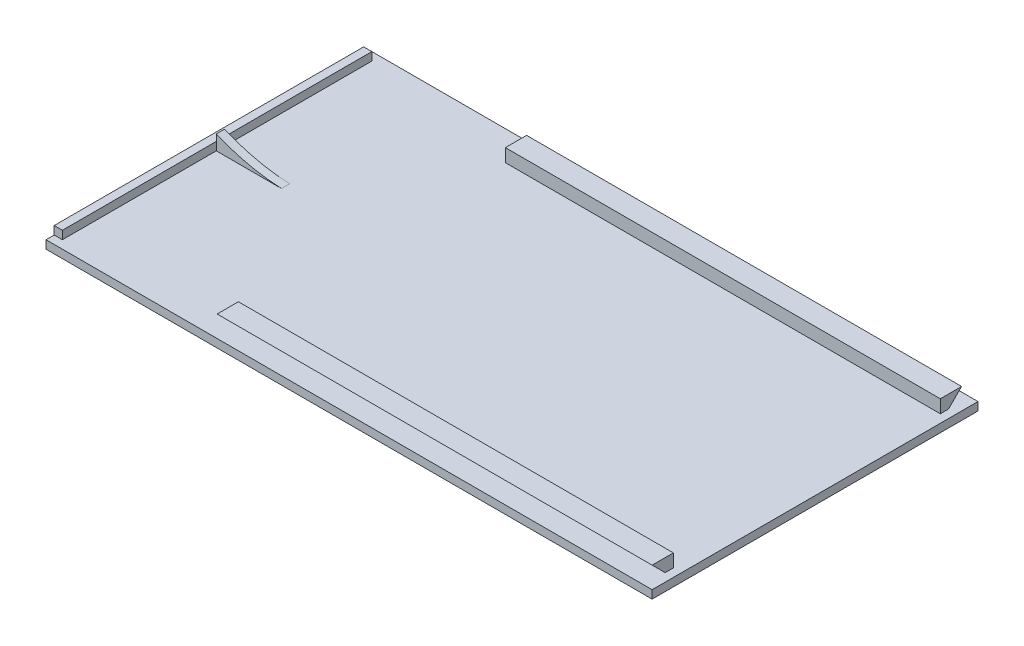
ISO-10303-21;
HEADER;
FILE_DESCRIPTION(('STEP AP214'),'2;1');
FILE_NAME('part.step','',(''),(''),'','','');
FILE_SCHEMA(('AUTOMOTIVE_DESIGN { 1 0 10303 214 1 1 1 1 }'));
ENDSEC;
DATA;
#1=APPLICATION_CONTEXT('core data for automotive mechanical design processes');
#2=APPLICATION_PROTOCOL_DEFINITION('international standard','automotive_design',2000,#1);
#3=PRODUCT_CONTEXT('',#1,'mechanical');
#4=PRODUCT('Part','Part','',(#3));
#5=PRODUCT_RELATED_PRODUCT_CATEGORY('part','',(#4));
#6=PRODUCT_DEFINITION_FORMATION('','',#4);
#7=PRODUCT_DEFINITION_CONTEXT('part definition',#1,'design');
#8=PRODUCT_DEFINITION('design','',#6,#7);
#9=PRODUCT_DEFINITION_SHAPE('','',#8);
#10=(LENGTH_UNIT() NAMED_UNIT(*) SI_UNIT(.MILLI.,.METRE.));
#11=(NAMED_UNIT(*) PLANE_ANGLE_UNIT() SI_UNIT($,.RADIAN.));
#12=(NAMED_UNIT(*) SI_UNIT($,.STERADIAN.) SOLID_ANGLE_UNIT());
#13=UNCERTAINTY_MEASURE_WITH_UNIT(LENGTH_MEASURE(1.E-05),#10,'distance_accuracy_value','');
#14=(GEOMETRIC_REPRESENTATION_CONTEXT(3) GLOBAL_UNCERTAINTY_ASSIGNED_CONTEXT((#13)) GLOBAL_UNIT_ASSIGNED_CONTEXT((#10,
#11,#12)) REPRESENTATION_CONTEXT('',''));
#15=CARTESIAN_POINT('',(0.,0.,0.));
#16=DIRECTION('',(0.,0.,1.));
#17=DIRECTION('',(1.,0.,0.));
#18=AXIS2_PLACEMENT_3D('',#15,#16,#17);
#19=CARTESIAN_POINT('',(0.,1.26,0.));
#20=DIRECTION('',(0.,-1.,0.));
#21=DIRECTION('',(0.,0.,-1.));
#22=AXIS2_PLACEMENT_3D('',#19,#20,#21);
#23=PLANE('',#22);
#24=DIRECTION('',(0.,0.,1.));
#25=VECTOR('',#24,1.);
#26=CARTESIAN_POINT('',(25.,1.26,-45.48));
#27=LINE('',#26,#25);
#28=CARTESIAN_POINT('',(25.,1.26,-46.7377762362813));
#29=VERTEX_POINT('',#28);
#30=CARTESIAN_POINT('',(25.,1.26,-45.48));
#31=VERTEX_POINT('',#30);
#32=EDGE_CURVE('E58',#29,#31,#27,.T.);
#33=ORIENTED_EDGE('',*,*,#32,.F.);
#34=DIRECTION('',(1.,0.,0.));
#35=VECTOR('',#34,1.);
#36=CARTESIAN_POINT('',(19.74,1.26,-46.7377762362813));
#37=LINE('',#36,#35);
#38=CARTESIAN_POINT('',(91.74,1.26,-46.7377762362813));
#39=VERTEX_POINT('',#38);
#40=EDGE_CURVE('E194',#29,#39,#37,.T.);
#41=ORIENTED_EDGE('',*,*,#40,.T.);
#42=DIRECTION('',(0.,0.,-1.));
#43=VECTOR('',#42,1.);
#44=CARTESIAN_POINT('',(91.74,1.26,-45.48));
#45=LINE('',#44,#43);
#46=CARTESIAN_POINT('',(91.74,1.26,-45.48));
#47=VERTEX_POINT('',#46);
#48=EDGE_CURVE('E193',#47,#39,#45,.T.);
#49=ORIENTED_EDGE('',*,*,#48,.F.);
#50=DIRECTION('',(1.,0.,0.));
#51=VECTOR('',#50,1.);
#52=CARTESIAN_POINT('',(25.,1.26,-45.48));
#53=LINE('',#52,#51);
#54=EDGE_CURVE('E205',#31,#47,#53,.T.);
#55=ORIENTED_EDGE('',*,*,#54,.F.);
#56=EDGE_LOOP('',(#33,#41,#49,#55));
#57=FACE_BOUND('',#56,.T.);
#58=DIRECTION('',(1.,0.,0.));
#59=VECTOR('',#58,1.);
#60=CARTESIAN_POINT('',(19.74,1.26,-3.26222376371873));
#61=LINE('',#60,#59);
#62=CARTESIAN_POINT('',(25.,1.26,-3.26222376371873));
#63=VERTEX_POINT('',#62);
#64=CARTESIAN_POINT('',(91.74,1.26,-3.26222376371873));
#65=VERTEX_POINT('',#64);
#66=EDGE_CURVE('E579',#63,#65,#61,.T.);
#67=ORIENTED_EDGE('',*,*,#66,.F.);
#68=DIRECTION('',(0.,0.,1.));
#69=VECTOR('',#68,1.);
#70=CARTESIAN_POINT('',(25.,1.26,-1.26));
#71=LINE('',#70,#69);
#72=CARTESIAN_POINT('',(25.,1.26,-4.52));
#73=VERTEX_POINT('',#72);
#74=EDGE_CURVE('E592',#73,#63,#71,.T.);
#75=ORIENTED_EDGE('',*,*,#74,.F.);
#76=DIRECTION('',(-1.,0.,0.));
#77=VECTOR('',#76,1.);
#78=CARTESIAN_POINT('',(25.,1.26,-4.52));
#79=LINE('',#78,#77);
#80=CARTESIAN_POINT('',(91.74,1.26,-4.52));
#81=VERTEX_POINT('',#80);
#82=EDGE_CURVE('E590',#81,#73,#79,.T.);
#83=ORIENTED_EDGE('',*,*,#82,.F.);
#84=DIRECTION('',(0.,0.,-1.));
#85=VECTOR('',#84,1.);
#86=CARTESIAN_POINT('',(91.74,1.26,-1.26));
#87=LINE('',#86,#85);
#88=EDGE_CURVE('E50',#65,#81,#87,.T.);
#89=ORIENTED_EDGE('',*,*,#88,.F.);
#90=EDGE_LOOP('',(#67,#75,#83,#89));
#91=FACE_BOUND('',#90,.T.);
#92=DIRECTION('',(1.,0.,0.));
#93=VECTOR('',#92,1.);
#94=CARTESIAN_POINT('',(1.25999999999998,1.26,-24.87));
#95=LINE('',#94,#93);
#96=CARTESIAN_POINT('',(1.25999999999998,1.26,-24.87));
#97=VERTEX_POINT('',#96);
#98=CARTESIAN_POINT('',(11.26,1.26,-24.87));
#99=VERTEX_POINT('',#98);
#100=EDGE_CURVE('E218',#97,#99,#95,.T.);
#101=ORIENTED_EDGE('',*,*,#100,.F.);
#102=DIRECTION('',(0.,0.,-1.));
#103=VECTOR('',#102,1.);
#104=CARTESIAN_POINT('',(1.25999999999997,1.26,-48.74));
#105=LINE('',#104,#103);
#106=CARTESIAN_POINT('',(1.25999999999998,1.26,-1.26));
#107=VERTEX_POINT('',#106);
#108=EDGE_CURVE('E250',#107,#97,#105,.T.);
#109=ORIENTED_EDGE('',*,*,#108,.F.);
#110=DIRECTION('',(1.,0.,0.));
#111=VECTOR('',#110,1.);
#112=CARTESIAN_POINT('',(0.,1.26,-1.26));
#113=LINE('',#112,#111);
#114=CARTESIAN_POINT('',(0.,1.26,-1.26));
#115=VERTEX_POINT('',#114);
#116=EDGE_CURVE('E235',#115,#107,#113,.T.);
#117=ORIENTED_EDGE('',*,*,#116,.F.);
#118=DIRECTION('',(0.,0.,1.));
#119=VECTOR('',#118,1.);
#120=CARTESIAN_POINT('',(0.,1.26,0.));
#121=LINE('',#120,#119);
#122=CARTESIAN_POINT('',(0.,1.26,0.));
#123=VERTEX_POINT('',#122);
#124=EDGE_CURVE('E287',#115,#123,#121,.T.);
#125=ORIENTED_EDGE('',*,*,#124,.T.);
#126=DIRECTION('',(1.,0.,0.));
#127=VECTOR('',#126,1.);
#128=CARTESIAN_POINT('',(0.,1.26,0.));
#129=LINE('',#128,#127);
#130=CARTESIAN_POINT('',(93.,1.26,0.));
#131=VERTEX_POINT('',#130);
#132=EDGE_CURVE('E283',#123,#131,#129,.T.);
#133=ORIENTED_EDGE('',*,*,#132,.T.);
#134=DIRECTION('',(0.,0.,-1.));
#135=VECTOR('',#134,1.);
#136=CARTESIAN_POINT('',(93.,1.26,0.));
#137=LINE('',#136,#135);
#138=CARTESIAN_POINT('',(93.,1.26,-50.));
#139=VERTEX_POINT('',#138);
#140=EDGE_CURVE('E309',#131,#139,#137,.T.);
#141=ORIENTED_EDGE('',*,*,#140,.T.);
#142=DIRECTION('',(-1.,0.,0.));
#143=VECTOR('',#142,1.);
#144=CARTESIAN_POINT('',(0.,1.26,-50.));
#145=LINE('',#144,#143);
#146=CARTESIAN_POINT('',(0.,1.26,-50.));
#147=VERTEX_POINT('',#146);
#148=EDGE_CURVE('E300',#139,#147,#145,.T.);
#149=ORIENTED_EDGE('',*,*,#148,.T.);
#150=CARTESIAN_POINT('',(0.,1.26,-48.74));
#151=VERTEX_POINT('',#150);
#152=EDGE_CURVE('E290',#147,#151,#121,.T.);
#153=ORIENTED_EDGE('',*,*,#152,.T.);
#154=DIRECTION('',(-1.,0.,0.));
#155=VECTOR('',#154,1.);
#156=CARTESIAN_POINT('',(0.,1.26,-48.74));
#157=LINE('',#156,#155);
#158=CARTESIAN_POINT('',(1.25999999999997,1.26,-48.74));
#159=VERTEX_POINT('',#158);
#160=EDGE_CURVE('E240',#159,#151,#157,.T.);
#161=ORIENTED_EDGE('',*,*,#160,.F.);
#162=CARTESIAN_POINT('',(1.25999999999998,1.26,-26.13));
#163=VERTEX_POINT('',#162);
#164=EDGE_CURVE('E253',#163,#159,#105,.T.);
#165=ORIENTED_EDGE('',*,*,#164,.F.);
#166=DIRECTION('',(-1.,0.,0.));
#167=VECTOR('',#166,1.);
#168=CARTESIAN_POINT('',(1.25999999999998,1.26,-26.13));
#169=LINE('',#168,#167);
#170=CARTESIAN_POINT('',(11.26,1.26,-26.13));
#171=VERTEX_POINT('',#170);
#172=EDGE_CURVE('E223',#171,#163,#169,.T.);
#173=ORIENTED_EDGE('',*,*,#172,.F.);
#174=DIRECTION('',(0.,0.,-1.));
#175=VECTOR('',#174,1.);
#176=CARTESIAN_POINT('',(11.26,1.26,-26.13));
#177=LINE('',#176,#175);
#178=EDGE_CURVE('E226',#99,#171,#177,.T.);
#179=ORIENTED_EDGE('',*,*,#178,.F.);
#180=EDGE_LOOP('',(#101,#109,#117,#125,#133,#141,#149,#153,#161,#165,#173,#179));
#181=FACE_BOUND('',#180,.T.);
#182=ADVANCED_FACE('F33',(#57,#91,#181),#23,.F.);
#183=CARTESIAN_POINT('',(1.25999999999997,2.52,-48.74));
#184=DIRECTION('',(-1.,0.,0.));
#185=DIRECTION('',(0.,0.,1.));
#186=AXIS2_PLACEMENT_3D('',#183,#184,#185);
#187=PLANE('',#186);
#188=DIRECTION('',(0.,-1.,0.));
#189=VECTOR('',#188,1.);
#190=CARTESIAN_POINT('',(1.25999999999998,3.52,-24.87));
#191=LINE('',#190,#189);
#192=CARTESIAN_POINT('',(1.25999999999998,2.52,-24.87));
#193=VERTEX_POINT('',#192);
#194=EDGE_CURVE('E231',#193,#97,#191,.T.);
#195=ORIENTED_EDGE('',*,*,#194,.F.);
#196=DIRECTION('',(0.,0.,-1.));
#197=VECTOR('',#196,1.);
#198=CARTESIAN_POINT('',(1.25999999999997,2.52,-48.74));
#199=LINE('',#198,#197);
#200=CARTESIAN_POINT('',(1.25999999999998,2.52,-1.26));
#201=VERTEX_POINT('',#200);
#202=EDGE_CURVE('E243',#201,#193,#199,.T.);
#203=ORIENTED_EDGE('',*,*,#202,.F.);
#204=DIRECTION('',(0.,-1.,0.));
#205=VECTOR('',#204,1.);
#206=CARTESIAN_POINT('',(1.25999999999998,2.52,-1.26));
#207=LINE('',#206,#205);
#208=EDGE_CURVE('E269',#201,#107,#207,.T.);
#209=ORIENTED_EDGE('',*,*,#208,.T.);
#210=ORIENTED_EDGE('',*,*,#108,.T.);
#211=EDGE_LOOP('',(#195,#203,#209,#210));
#212=FACE_BOUND('',#211,.T.);
#213=ADVANCED_FACE('F359',(#212),#187,.F.);
#214=DIRECTION('',(0.,-1.,0.));
#215=VECTOR('',#214,1.);
#216=CARTESIAN_POINT('',(1.25999999999998,3.52,-26.13));
#217=LINE('',#216,#215);
#218=CARTESIAN_POINT('',(1.25999999999997,2.52,-26.13));
#219=VERTEX_POINT('',#218);
#220=EDGE_CURVE('E222',#219,#163,#217,.T.);
#221=ORIENTED_EDGE('',*,*,#220,.T.);
#222=ORIENTED_EDGE('',*,*,#164,.T.);
#223=DIRECTION('',(0.,-1.,0.));
#224=VECTOR('',#223,1.);
#225=CARTESIAN_POINT('',(1.25999999999997,2.52,-48.74));
#226=LINE('',#225,#224);
#227=CARTESIAN_POINT('',(1.25999999999997,2.52,-48.74));
#228=VERTEX_POINT('',#227);
#229=EDGE_CURVE('E256',#228,#159,#226,.T.);
#230=ORIENTED_EDGE('',*,*,#229,.F.);
#231=EDGE_CURVE('E242',#219,#228,#199,.T.);
#232=ORIENTED_EDGE('',*,*,#231,.F.);
#233=EDGE_LOOP('',(#221,#222,#230,#232));
#234=FACE_BOUND('',#233,.T.);
#235=ADVANCED_FACE('F338',(#234),#187,.F.);
#236=CARTESIAN_POINT('',(0.,1.26,0.));
#237=DIRECTION('',(1.,0.,0.));
#238=DIRECTION('',(0.,0.,-1.));
#239=AXIS2_PLACEMENT_3D('',#236,#237,#238);
#240=PLANE('',#239);
#241=DIRECTION('',(0.,0.,1.));
#242=VECTOR('',#241,1.);
#243=CARTESIAN_POINT('',(0.,0.,0.));
#244=LINE('',#243,#242);
#245=CARTESIAN_POINT('',(0.,0.,-50.));
#246=VERTEX_POINT('',#245);
#247=CARTESIAN_POINT('',(0.,0.,0.));
#248=VERTEX_POINT('',#247);
#249=EDGE_CURVE('E279',#246,#248,#244,.T.);
#250=ORIENTED_EDGE('',*,*,#249,.T.);
#251=DIRECTION('',(0.,-1.,0.));
#252=VECTOR('',#251,1.);
#253=CARTESIAN_POINT('',(0.,1.26,0.));
#254=LINE('',#253,#252);
#255=EDGE_CURVE('E11',#123,#248,#254,.T.);
#256=ORIENTED_EDGE('',*,*,#255,.F.);
#257=ORIENTED_EDGE('',*,*,#124,.F.);
#258=DIRECTION('',(0.,-1.,0.));
#259=VECTOR('',#258,1.);
#260=CARTESIAN_POINT('',(0.,2.52,-1.26));
#261=LINE('',#260,#259);
#262=CARTESIAN_POINT('',(0.,2.52,-1.26));
#263=VERTEX_POINT('',#262);
#264=EDGE_CURVE('E274',#263,#115,#261,.T.);
#265=ORIENTED_EDGE('',*,*,#264,.F.);
#266=DIRECTION('',(0.,0.,1.));
#267=VECTOR('',#266,1.);
#268=CARTESIAN_POINT('',(0.,2.52,-48.74));
#269=LINE('',#268,#267);
#270=CARTESIAN_POINT('',(0.,2.52,-48.74));
#271=VERTEX_POINT('',#270);
#272=EDGE_CURVE('E236',#271,#263,#269,.T.);
#273=ORIENTED_EDGE('',*,*,#272,.F.);
#274=DIRECTION('',(0.,-1.,0.));
#275=VECTOR('',#274,1.);
#276=CARTESIAN_POINT('',(0.,2.52,-48.74));
#277=LINE('',#276,#275);
#278=EDGE_CURVE('E249',#271,#151,#277,.T.);
#279=ORIENTED_EDGE('',*,*,#278,.T.);
#280=ORIENTED_EDGE('',*,*,#152,.F.);
#281=DIRECTION('',(0.,-1.,0.));
#282=VECTOR('',#281,1.);
#283=CARTESIAN_POINT('',(0.,1.26,-50.));
#284=LINE('',#283,#282);
#285=EDGE_CURVE('E297',#147,#246,#284,.T.);
#286=ORIENTED_EDGE('',*,*,#285,.T.);
#287=EDGE_LOOP('',(#250,#256,#257,#265,#273,#279,#280,#286));
#288=FACE_BOUND('',#287,.T.);
#289=ADVANCED_FACE('F35',(#288),#240,.F.);
#290=CARTESIAN_POINT('',(0.,1.26,0.));
#291=DIRECTION('',(0.,0.,-1.));
#292=DIRECTION('',(-1.,0.,0.));
#293=AXIS2_PLACEMENT_3D('',#290,#291,#292);
#294=PLANE('',#293);
#295=DIRECTION('',(1.,0.,0.));
#296=VECTOR('',#295,1.);
#297=CARTESIAN_POINT('',(0.,0.,0.));
#298=LINE('',#297,#296);
#299=CARTESIAN_POINT('',(93.,0.,0.));
#300=VERTEX_POINT('',#299);
#301=EDGE_CURVE('E305',#248,#300,#298,.T.);
#302=ORIENTED_EDGE('',*,*,#301,.T.);
#303=DIRECTION('',(0.,-1.,0.));
#304=VECTOR('',#303,1.);
#305=CARTESIAN_POINT('',(93.,1.26,0.));
#306=LINE('',#305,#304);
#307=EDGE_CURVE('E42',#131,#300,#306,.T.);
#308=ORIENTED_EDGE('',*,*,#307,.F.);
#309=ORIENTED_EDGE('',*,*,#132,.F.);
#310=ORIENTED_EDGE('',*,*,#255,.T.);
#311=EDGE_LOOP('',(#302,#308,#309,#310));
#312=FACE_BOUND('',#311,.T.);
#313=ADVANCED_FACE('F319',(#312),#294,.F.);
#314=CARTESIAN_POINT('',(93.,1.26,0.));
#315=DIRECTION('',(-1.,0.,0.));
#316=DIRECTION('',(0.,0.,1.));
#317=AXIS2_PLACEMENT_3D('',#314,#315,#316);
#318=PLANE('',#317);
#319=DIRECTION('',(0.,0.,-1.));
#320=VECTOR('',#319,1.);
#321=CARTESIAN_POINT('',(93.,0.,0.));
#322=LINE('',#321,#320);
#323=CARTESIAN_POINT('',(93.,0.,-50.));
#324=VERTEX_POINT('',#323);
#325=EDGE_CURVE('E303',#300,#324,#322,.T.);
#326=ORIENTED_EDGE('',*,*,#325,.T.);
#327=DIRECTION('',(0.,-1.,0.));
#328=VECTOR('',#327,1.);
#329=CARTESIAN_POINT('',(93.,1.26,-50.));
#330=LINE('',#329,#328);
#331=EDGE_CURVE('E294',#139,#324,#330,.T.);
#332=ORIENTED_EDGE('',*,*,#331,.F.);
#333=ORIENTED_EDGE('',*,*,#140,.F.);
#334=ORIENTED_EDGE('',*,*,#307,.T.);
#335=EDGE_LOOP('',(#326,#332,#333,#334));
#336=FACE_BOUND('',#335,.T.);
#337=ADVANCED_FACE('F322',(#336),#318,.F.);
#338=CARTESIAN_POINT('',(0.,1.26,-50.));
#339=DIRECTION('',(0.,0.,1.));
#340=DIRECTION('',(1.,0.,0.));
#341=AXIS2_PLACEMENT_3D('',#338,#339,#340);
#342=PLANE('',#341);
#343=DIRECTION('',(-1.,0.,0.));
#344=VECTOR('',#343,1.);
#345=CARTESIAN_POINT('',(0.,0.,-50.));
#346=LINE('',#345,#344);
#347=EDGE_CURVE('E301',#324,#246,#346,.T.);
#348=ORIENTED_EDGE('',*,*,#347,.T.);
#349=ORIENTED_EDGE('',*,*,#285,.F.);
#350=ORIENTED_EDGE('',*,*,#148,.F.);
#351=ORIENTED_EDGE('',*,*,#331,.T.);
#352=EDGE_LOOP('',(#348,#349,#350,#351));
#353=FACE_BOUND('',#352,.T.);
#354=ADVANCED_FACE('F327',(#353),#342,.F.);
#355=CARTESIAN_POINT('',(0.,0.,0.));
#356=DIRECTION('',(0.,-1.,0.));
#357=DIRECTION('',(0.,0.,-1.));
#358=AXIS2_PLACEMENT_3D('',#355,#356,#357);
#359=PLANE('',#358);
#360=ORIENTED_EDGE('',*,*,#249,.F.);
#361=ORIENTED_EDGE('',*,*,#347,.F.);
#362=ORIENTED_EDGE('',*,*,#325,.F.);
#363=ORIENTED_EDGE('',*,*,#301,.F.);
#364=EDGE_LOOP('',(#360,#361,#362,#363));
#365=FACE_BOUND('',#364,.T.);
#366=ADVANCED_FACE('F348',(#365),#359,.T.);
#367=CARTESIAN_POINT('',(0.,2.52,-1.26));
#368=DIRECTION('',(0.,0.,-1.));
#369=DIRECTION('',(-1.,0.,0.));
#370=AXIS2_PLACEMENT_3D('',#367,#368,#369);
#371=PLANE('',#370);
#372=ORIENTED_EDGE('',*,*,#116,.T.);
#373=ORIENTED_EDGE('',*,*,#208,.F.);
#374=DIRECTION('',(1.,0.,0.));
#375=VECTOR('',#374,1.);
#376=CARTESIAN_POINT('',(0.,2.52,-1.26));
#377=LINE('',#376,#375);
#378=EDGE_CURVE('E239',#263,#201,#377,.T.);
#379=ORIENTED_EDGE('',*,*,#378,.F.);
#380=ORIENTED_EDGE('',*,*,#264,.T.);
#381=EDGE_LOOP('',(#372,#373,#379,#380));
#382=FACE_BOUND('',#381,.T.);
#383=ADVANCED_FACE('F345',(#382),#371,.F.);
#384=CARTESIAN_POINT('',(0.,2.52,-48.74));
#385=DIRECTION('',(0.,0.,1.));
#386=DIRECTION('',(1.,0.,0.));
#387=AXIS2_PLACEMENT_3D('',#384,#385,#386);
#388=PLANE('',#387);
#389=ORIENTED_EDGE('',*,*,#160,.T.);
#390=ORIENTED_EDGE('',*,*,#278,.F.);
#391=DIRECTION('',(-1.,0.,0.));
#392=VECTOR('',#391,1.);
#393=CARTESIAN_POINT('',(0.,2.52,-48.74));
#394=LINE('',#393,#392);
#395=EDGE_CURVE('E246',#228,#271,#394,.T.);
#396=ORIENTED_EDGE('',*,*,#395,.F.);
#397=ORIENTED_EDGE('',*,*,#229,.T.);
#398=EDGE_LOOP('',(#389,#390,#396,#397));
#399=FACE_BOUND('',#398,.T.);
#400=ADVANCED_FACE('F330',(#399),#388,.F.);
#401=CARTESIAN_POINT('',(0.,2.52,0.));
#402=DIRECTION('',(0.,1.,0.));
#403=DIRECTION('',(0.,0.,1.));
#404=AXIS2_PLACEMENT_3D('',#401,#402,#403);
#405=PLANE('',#404);
#406=ORIENTED_EDGE('',*,*,#272,.T.);
#407=ORIENTED_EDGE('',*,*,#378,.T.);
#408=ORIENTED_EDGE('',*,*,#202,.T.);
#409=EDGE_CURVE('E247',#193,#219,#199,.T.);
#410=ORIENTED_EDGE('',*,*,#409,.T.);
#411=ORIENTED_EDGE('',*,*,#231,.T.);
#412=ORIENTED_EDGE('',*,*,#395,.T.);
#413=EDGE_LOOP('',(#406,#407,#408,#410,#411,#412));
#414=FACE_BOUND('',#413,.T.);
#415=ADVANCED_FACE('F333',(#414),#405,.T.);
#416=CARTESIAN_POINT('',(1.25999999999998,3.52,-26.13));
#417=DIRECTION('',(1.,0.,0.));
#418=DIRECTION('',(0.,0.,-1.));
#419=AXIS2_PLACEMENT_3D('',#416,#417,#418);
#420=PLANE('',#419);
#421=ORIENTED_EDGE('',*,*,#409,.F.);
#422=CARTESIAN_POINT('',(1.25999999999999,3.52,-24.87));
#423=VERTEX_POINT('',#422);
#424=EDGE_CURVE('E232',#423,#193,#191,.T.);
#425=ORIENTED_EDGE('',*,*,#424,.F.);
#426=DIRECTION('',(0.,0.,1.));
#427=VECTOR('',#426,1.);
#428=CARTESIAN_POINT('',(1.25999999999998,3.52,-26.13));
#429=LINE('',#428,#427);
#430=CARTESIAN_POINT('',(1.25999999999998,3.52,-26.13));
#431=VERTEX_POINT('',#430);
#432=EDGE_CURVE('E220',#431,#423,#429,.T.);
#433=ORIENTED_EDGE('',*,*,#432,.F.);
#434=EDGE_CURVE('E229',#431,#219,#217,.T.);
#435=ORIENTED_EDGE('',*,*,#434,.T.);
#436=EDGE_LOOP('',(#421,#425,#433,#435));
#437=FACE_BOUND('',#436,.T.);
#438=ADVANCED_FACE('F371',(#437),#420,.F.);
#439=CARTESIAN_POINT('',(1.25999999999998,3.52,-24.87));
#440=DIRECTION('',(0.,0.,-1.));
#441=DIRECTION('',(-1.,0.,0.));
#442=AXIS2_PLACEMENT_3D('',#439,#440,#441);
#443=PLANE('',#442);
#444=ORIENTED_EDGE('',*,*,#100,.T.);
#445=CARTESIAN_POINT('',(12.4759318746487,29.8941233391537,-24.87));
#446=DIRECTION('',(0.,0.,1.));
#447=DIRECTION('',(1.,0.,0.));
#448=AXIS2_PLACEMENT_3D('',#445,#446,#447);
#449=CIRCLE('',#448,28.6599286413217);
#450=EDGE_CURVE('E214',#423,#99,#449,.T.);
#451=ORIENTED_EDGE('',*,*,#450,.F.);
#452=ORIENTED_EDGE('',*,*,#424,.T.);
#453=ORIENTED_EDGE('',*,*,#194,.T.);
#454=EDGE_LOOP('',(#444,#451,#452,#453));
#455=FACE_BOUND('',#454,.T.);
#456=ADVANCED_FACE('F374',(#455),#443,.F.);
#457=CARTESIAN_POINT('',(1.25999999999998,3.52,-26.13));
#458=DIRECTION('',(0.,0.,1.));
#459=DIRECTION('',(1.,0.,0.));
#460=AXIS2_PLACEMENT_3D('',#457,#458,#459);
#461=PLANE('',#460);
#462=ORIENTED_EDGE('',*,*,#434,.F.);
#463=CARTESIAN_POINT('',(12.4759318746487,29.8941233391537,-26.13));
#464=DIRECTION('',(0.,0.,1.));
#465=DIRECTION('',(1.,0.,0.));
#466=AXIS2_PLACEMENT_3D('',#463,#464,#465);
#467=CIRCLE('',#466,28.6599286413217);
#468=EDGE_CURVE('E215',#431,#171,#467,.T.);
#469=ORIENTED_EDGE('',*,*,#468,.T.);
#470=ORIENTED_EDGE('',*,*,#172,.T.);
#471=ORIENTED_EDGE('',*,*,#220,.F.);
#472=EDGE_LOOP('',(#462,#469,#470,#471));
#473=FACE_BOUND('',#472,.T.);
#474=ADVANCED_FACE('F378',(#473),#461,.F.);
#475=CARTESIAN_POINT('',(12.4759318746487,29.8941233391537,-26.13));
#476=DIRECTION('',(0.,0.,1.));
#477=DIRECTION('',(1.,0.,0.));
#478=AXIS2_PLACEMENT_3D('',#475,#476,#477);
#479=CYLINDRICAL_SURFACE('',#478,28.6599286413217);
#480=ORIENTED_EDGE('',*,*,#450,.T.);
#481=ORIENTED_EDGE('',*,*,#178,.T.);
#482=ORIENTED_EDGE('',*,*,#468,.F.);
#483=ORIENTED_EDGE('',*,*,#432,.T.);
#484=EDGE_LOOP('',(#480,#481,#482,#483));
#485=FACE_BOUND('',#484,.T.);
#486=ADVANCED_FACE('F382',(#485),#479,.F.);
#487=CARTESIAN_POINT('',(25.,3.26,-45.48));
#488=DIRECTION('',(1.,0.,0.));
#489=DIRECTION('',(0.,0.,-1.));
#490=AXIS2_PLACEMENT_3D('',#487,#488,#489);
#491=PLANE('',#490);
#492=DIRECTION('',(0.,0.,1.));
#493=VECTOR('',#492,1.);
#494=CARTESIAN_POINT('',(25.,3.26,-45.48));
#495=LINE('',#494,#493);
#496=CARTESIAN_POINT('',(25.,3.26,-48.74));
#497=VERTEX_POINT('',#496);
#498=CARTESIAN_POINT('',(25.,3.26,-45.48));
#499=VERTEX_POINT('',#498);
#500=EDGE_CURVE('E200',#497,#499,#495,.T.);
#501=ORIENTED_EDGE('',*,*,#500,.F.);
#502=DIRECTION('',(0.,-0.706713780918726,0.707499563151496));
#503=VECTOR('',#502,1.);
#504=CARTESIAN_POINT('',(25.,1.63000100644956,-47.1081886401378));
#505=LINE('',#504,#503);
#506=EDGE_CURVE('E181',#497,#29,#505,.T.);
#507=ORIENTED_EDGE('',*,*,#506,.T.);
#508=ORIENTED_EDGE('',*,*,#32,.T.);
#509=DIRECTION('',(0.,-1.,0.));
#510=VECTOR('',#509,1.);
#511=CARTESIAN_POINT('',(25.,3.26,-45.48));
#512=LINE('',#511,#510);
#513=EDGE_CURVE('E211',#499,#31,#512,.T.);
#514=ORIENTED_EDGE('',*,*,#513,.F.);
#515=EDGE_LOOP('',(#501,#507,#508,#514));
#516=FACE_BOUND('',#515,.T.);
#517=ADVANCED_FACE('F386',(#516),#491,.F.);
#518=CARTESIAN_POINT('',(25.,3.26,-45.48));
#519=DIRECTION('',(0.,0.,-1.));
#520=DIRECTION('',(-1.,0.,0.));
#521=AXIS2_PLACEMENT_3D('',#518,#519,#520);
#522=PLANE('',#521);
#523=ORIENTED_EDGE('',*,*,#54,.T.);
#524=DIRECTION('',(0.,-1.,0.));
#525=VECTOR('',#524,1.);
#526=CARTESIAN_POINT('',(91.74,3.26,-45.48));
#527=LINE('',#526,#525);
#528=CARTESIAN_POINT('',(91.74,3.26,-45.48));
#529=VERTEX_POINT('',#528);
#530=EDGE_CURVE('E186',#529,#47,#527,.T.);
#531=ORIENTED_EDGE('',*,*,#530,.F.);
#532=DIRECTION('',(1.,0.,0.));
#533=VECTOR('',#532,1.);
#534=CARTESIAN_POINT('',(25.,3.26,-45.48));
#535=LINE('',#534,#533);
#536=EDGE_CURVE('E197',#499,#529,#535,.T.);
#537=ORIENTED_EDGE('',*,*,#536,.F.);
#538=ORIENTED_EDGE('',*,*,#513,.T.);
#539=EDGE_LOOP('',(#523,#531,#537,#538));
#540=FACE_BOUND('',#539,.T.);
#541=ADVANCED_FACE('F390',(#540),#522,.F.);
#542=CARTESIAN_POINT('',(91.74,3.26,-45.48));
#543=DIRECTION('',(-1.,0.,0.));
#544=DIRECTION('',(0.,0.,1.));
#545=AXIS2_PLACEMENT_3D('',#542,#543,#544);
#546=PLANE('',#545);
#547=ORIENTED_EDGE('',*,*,#48,.T.);
#548=DIRECTION('',(0.,-0.706713780918726,0.707499563151496));
#549=VECTOR('',#548,1.);
#550=CARTESIAN_POINT('',(91.74,1.26,-46.7377762362813));
#551=LINE('',#550,#549);
#552=CARTESIAN_POINT('',(91.74,3.26,-48.74));
#553=VERTEX_POINT('',#552);
#554=EDGE_CURVE('E179',#553,#39,#551,.T.);
#555=ORIENTED_EDGE('',*,*,#554,.F.);
#556=DIRECTION('',(0.,0.,-1.));
#557=VECTOR('',#556,1.);
#558=CARTESIAN_POINT('',(91.74,3.26,-45.48));
#559=LINE('',#558,#557);
#560=EDGE_CURVE('E187',#529,#553,#559,.T.);
#561=ORIENTED_EDGE('',*,*,#560,.F.);
#562=ORIENTED_EDGE('',*,*,#530,.T.);
#563=EDGE_LOOP('',(#547,#555,#561,#562));
#564=FACE_BOUND('',#563,.T.);
#565=ADVANCED_FACE('F191',(#564),#546,.F.);
#566=CARTESIAN_POINT('',(0.,3.26,0.));
#567=DIRECTION('',(0.,-1.,0.));
#568=DIRECTION('',(0.,0.,-1.));
#569=AXIS2_PLACEMENT_3D('',#566,#567,#568);
#570=PLANE('',#569);
#571=ORIENTED_EDGE('',*,*,#500,.T.);
#572=ORIENTED_EDGE('',*,*,#536,.T.);
#573=ORIENTED_EDGE('',*,*,#560,.T.);
#574=DIRECTION('',(-1.,0.,0.));
#575=VECTOR('',#574,1.);
#576=CARTESIAN_POINT('',(25.,3.26,-48.74));
#577=LINE('',#576,#575);
#578=EDGE_CURVE('E176',#553,#497,#577,.T.);
#579=ORIENTED_EDGE('',*,*,#578,.T.);
#580=EDGE_LOOP('',(#571,#572,#573,#579));
#581=FACE_BOUND('',#580,.T.);
#582=ADVANCED_FACE('F196',(#581),#570,.F.);
#583=CARTESIAN_POINT('',(25.,3.26,-1.26));
#584=DIRECTION('',(1.,0.,0.));
#585=DIRECTION('',(0.,0.,-1.));
#586=AXIS2_PLACEMENT_3D('',#583,#584,#585);
#587=PLANE('',#586);
#588=ORIENTED_EDGE('',*,*,#74,.T.);
#589=DIRECTION('',(0.,0.706713780918728,0.707499563151495));
#590=VECTOR('',#589,1.);
#591=CARTESIAN_POINT('',(25.,3.26,-1.26));
#592=LINE('',#591,#590);
#593=CARTESIAN_POINT('',(25.,3.26,-1.26));
#594=VERTEX_POINT('',#593);
#595=EDGE_CURVE('E583',#63,#594,#592,.T.);
#596=ORIENTED_EDGE('',*,*,#595,.T.);
#597=DIRECTION('',(0.,0.,1.));
#598=VECTOR('',#597,1.);
#599=CARTESIAN_POINT('',(25.,3.26,-1.26));
#600=LINE('',#599,#598);
#601=CARTESIAN_POINT('',(25.,3.26,-4.52));
#602=VERTEX_POINT('',#601);
#603=EDGE_CURVE('E594',#602,#594,#600,.T.);
#604=ORIENTED_EDGE('',*,*,#603,.F.);
#605=DIRECTION('',(0.,-1.,0.));
#606=VECTOR('',#605,1.);
#607=CARTESIAN_POINT('',(25.,3.26,-4.52));
#608=LINE('',#607,#606);
#609=EDGE_CURVE('E599',#602,#73,#608,.T.);
#610=ORIENTED_EDGE('',*,*,#609,.T.);
#611=EDGE_LOOP('',(#588,#596,#604,#610));
#612=FACE_BOUND('',#611,.T.);
#613=ADVANCED_FACE('F398',(#612),#587,.F.);
#614=CARTESIAN_POINT('',(91.74,3.26,-1.26));
#615=DIRECTION('',(-1.,0.,0.));
#616=DIRECTION('',(0.,0.,1.));
#617=AXIS2_PLACEMENT_3D('',#614,#615,#616);
#618=PLANE('',#617);
#619=DIRECTION('',(0.,0.,-1.));
#620=VECTOR('',#619,1.);
#621=CARTESIAN_POINT('',(91.74,3.26,-1.26));
#622=LINE('',#621,#620);
#623=CARTESIAN_POINT('',(91.74,3.26,-1.26));
#624=VERTEX_POINT('',#623);
#625=CARTESIAN_POINT('',(91.74,3.26,-4.52));
#626=VERTEX_POINT('',#625);
#627=EDGE_CURVE('E587',#624,#626,#622,.T.);
#628=ORIENTED_EDGE('',*,*,#627,.F.);
#629=DIRECTION('',(0.,0.706713780918728,0.707499563151495));
#630=VECTOR('',#629,1.);
#631=CARTESIAN_POINT('',(91.74,1.26,-3.26222376371873));
#632=LINE('',#631,#630);
#633=EDGE_CURVE('E580',#65,#624,#632,.T.);
#634=ORIENTED_EDGE('',*,*,#633,.F.);
#635=ORIENTED_EDGE('',*,*,#88,.T.);
#636=DIRECTION('',(0.,-1.,0.));
#637=VECTOR('',#636,1.);
#638=CARTESIAN_POINT('',(91.74,3.26,-4.52));
#639=LINE('',#638,#637);
#640=EDGE_CURVE('E206',#626,#81,#639,.T.);
#641=ORIENTED_EDGE('',*,*,#640,.F.);
#642=EDGE_LOOP('',(#628,#634,#635,#641));
#643=FACE_BOUND('',#642,.T.);
#644=ADVANCED_FACE('F401',(#643),#618,.F.);
#645=CARTESIAN_POINT('',(25.,3.26,-4.52));
#646=DIRECTION('',(0.,0.,1.));
#647=DIRECTION('',(1.,0.,0.));
#648=AXIS2_PLACEMENT_3D('',#645,#646,#647);
#649=PLANE('',#648);
#650=ORIENTED_EDGE('',*,*,#82,.T.);
#651=ORIENTED_EDGE('',*,*,#609,.F.);
#652=DIRECTION('',(-1.,0.,0.));
#653=VECTOR('',#652,1.);
#654=CARTESIAN_POINT('',(25.,3.26,-4.52));
#655=LINE('',#654,#653);
#656=EDGE_CURVE('E602',#626,#602,#655,.T.);
#657=ORIENTED_EDGE('',*,*,#656,.F.);
#658=ORIENTED_EDGE('',*,*,#640,.T.);
#659=EDGE_LOOP('',(#650,#651,#657,#658));
#660=FACE_BOUND('',#659,.T.);
#661=ADVANCED_FACE('F405',(#660),#649,.F.);
#662=CARTESIAN_POINT('',(0.,3.26,0.));
#663=DIRECTION('',(0.,-1.,0.));
#664=DIRECTION('',(0.,0.,-1.));
#665=AXIS2_PLACEMENT_3D('',#662,#663,#664);
#666=PLANE('',#665);
#667=ORIENTED_EDGE('',*,*,#603,.T.);
#668=DIRECTION('',(1.,0.,0.));
#669=VECTOR('',#668,1.);
#670=CARTESIAN_POINT('',(25.,3.26,-1.26));
#671=LINE('',#670,#669);
#672=EDGE_CURVE('E609',#594,#624,#671,.T.);
#673=ORIENTED_EDGE('',*,*,#672,.T.);
#674=ORIENTED_EDGE('',*,*,#627,.T.);
#675=ORIENTED_EDGE('',*,*,#656,.T.);
#676=EDGE_LOOP('',(#667,#673,#674,#675));
#677=FACE_BOUND('',#676,.T.);
#678=ADVANCED_FACE('F408',(#677),#666,.F.);
#679=CARTESIAN_POINT('',(19.74,1.26,-3.26222376371873));
#680=DIRECTION('',(0.,0.707499563151495,-0.706713780918728));
#681=DIRECTION('',(0.,0.706713780918728,0.707499563151495));
#682=AXIS2_PLACEMENT_3D('',#679,#680,#681);
#683=PLANE('',#682);
#684=ORIENTED_EDGE('',*,*,#66,.T.);
#685=ORIENTED_EDGE('',*,*,#633,.T.);
#686=ORIENTED_EDGE('',*,*,#672,.F.);
#687=ORIENTED_EDGE('',*,*,#595,.F.);
#688=EDGE_LOOP('',(#684,#685,#686,#687));
#689=FACE_BOUND('',#688,.T.);
#690=ADVANCED_FACE('F412',(#689),#683,.F.);
#691=CARTESIAN_POINT('',(19.74,1.26,-46.7377762362813));
#692=DIRECTION('',(0.,0.707499563151496,0.706713780918726));
#693=DIRECTION('',(0.,-0.706713780918726,0.707499563151496));
#694=AXIS2_PLACEMENT_3D('',#691,#692,#693);
#695=PLANE('',#694);
#696=ORIENTED_EDGE('',*,*,#578,.F.);
#697=ORIENTED_EDGE('',*,*,#554,.T.);
#698=ORIENTED_EDGE('',*,*,#40,.F.);
#699=ORIENTED_EDGE('',*,*,#506,.F.);
#700=EDGE_LOOP('',(#696,#697,#698,#699));
#701=FACE_BOUND('',#700,.T.);
#702=ADVANCED_FACE('F178',(#701),#695,.F.);
#703=CLOSED_SHELL('',(#182,#213,#235,#289,#313,#337,#354,#366,#383,#400,#415,#438,#456,#474,
#486,#517,#541,#565,#582,#613,#644,#661,#678,#690,#702));
#704=MANIFOLD_SOLID_BREP('B2',#703);
#705=ADVANCED_BREP_SHAPE_REPRESENTATION('',(#18,#704),#14);
#706=SHAPE_DEFINITION_REPRESENTATION(#9,#705);
ENDSEC;
END-ISO-10303-21;
